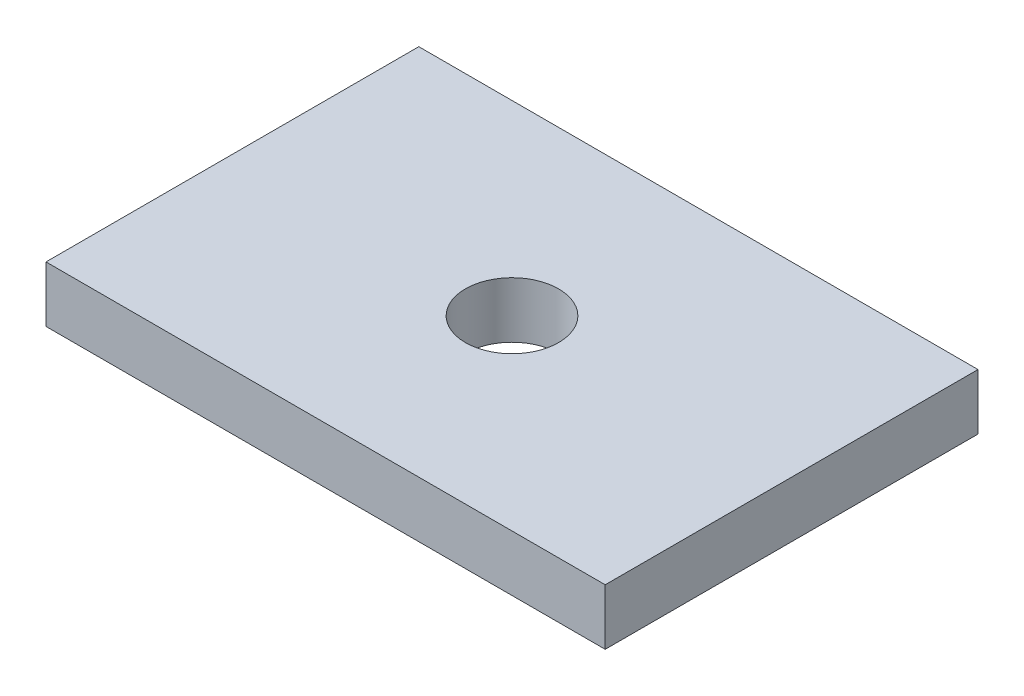
ISO-10303-21;
HEADER;
FILE_DESCRIPTION(('STEP AP214'),'2;1');
FILE_NAME('part.step','',(''),(''),'','','');
FILE_SCHEMA(('AUTOMOTIVE_DESIGN { 1 0 10303 214 1 1 1 1 }'));
ENDSEC;
DATA;
#1=APPLICATION_CONTEXT('core data for automotive mechanical design processes');
#2=APPLICATION_PROTOCOL_DEFINITION('international standard','automotive_design',2000,#1);
#3=PRODUCT_CONTEXT('',#1,'mechanical');
#4=PRODUCT('Part','Part','',(#3));
#5=PRODUCT_RELATED_PRODUCT_CATEGORY('part','',(#4));
#6=PRODUCT_DEFINITION_FORMATION('','',#4);
#7=PRODUCT_DEFINITION_CONTEXT('part definition',#1,'design');
#8=PRODUCT_DEFINITION('design','',#6,#7);
#9=PRODUCT_DEFINITION_SHAPE('','',#8);
#10=(LENGTH_UNIT() NAMED_UNIT(*) SI_UNIT(.MILLI.,.METRE.));
#11=(NAMED_UNIT(*) PLANE_ANGLE_UNIT() SI_UNIT($,.RADIAN.));
#12=(NAMED_UNIT(*) SI_UNIT($,.STERADIAN.) SOLID_ANGLE_UNIT());
#13=UNCERTAINTY_MEASURE_WITH_UNIT(LENGTH_MEASURE(1.E-05),#10,'distance_accuracy_value','');
#14=(GEOMETRIC_REPRESENTATION_CONTEXT(3) GLOBAL_UNCERTAINTY_ASSIGNED_CONTEXT((#13)) GLOBAL_UNIT_ASSIGNED_CONTEXT((#10,
#11,#12)) REPRESENTATION_CONTEXT('',''));
#15=CARTESIAN_POINT('',(0.,0.,0.));
#16=DIRECTION('',(0.,0.,1.));
#17=DIRECTION('',(1.,0.,0.));
#18=AXIS2_PLACEMENT_3D('',#15,#16,#17);
#19=CARTESIAN_POINT('',(30.,6.,-20.));
#20=DIRECTION('',(-1.,0.,0.));
#21=DIRECTION('',(0.,0.,1.));
#22=AXIS2_PLACEMENT_3D('',#19,#20,#21);
#23=PLANE('',#22);
#24=DIRECTION('',(0.,0.,-1.));
#25=VECTOR('',#24,1.);
#26=CARTESIAN_POINT('',(30.,0.,-20.));
#27=LINE('',#26,#25);
#28=CARTESIAN_POINT('',(30.,0.,20.));
#29=VERTEX_POINT('',#28);
#30=CARTESIAN_POINT('',(30.,0.,-20.));
#31=VERTEX_POINT('',#30);
#32=EDGE_CURVE('E97',#29,#31,#27,.T.);
#33=ORIENTED_EDGE('',*,*,#32,.T.);
#34=DIRECTION('',(0.,-1.,0.));
#35=VECTOR('',#34,1.);
#36=CARTESIAN_POINT('',(30.,6.,-20.));
#37=LINE('',#36,#35);
#38=CARTESIAN_POINT('',(30.,6.,-20.));
#39=VERTEX_POINT('',#38);
#40=EDGE_CURVE('E11',#39,#31,#37,.T.);
#41=ORIENTED_EDGE('',*,*,#40,.F.);
#42=DIRECTION('',(0.,0.,-1.));
#43=VECTOR('',#42,1.);
#44=CARTESIAN_POINT('',(30.,6.,-20.));
#45=LINE('',#44,#43);
#46=CARTESIAN_POINT('',(30.,6.,20.));
#47=VERTEX_POINT('',#46);
#48=EDGE_CURVE('E85',#47,#39,#45,.T.);
#49=ORIENTED_EDGE('',*,*,#48,.F.);
#50=DIRECTION('',(0.,-1.,0.));
#51=VECTOR('',#50,1.);
#52=CARTESIAN_POINT('',(30.,6.,20.));
#53=LINE('',#52,#51);
#54=EDGE_CURVE('E93',#47,#29,#53,.T.);
#55=ORIENTED_EDGE('',*,*,#54,.T.);
#56=EDGE_LOOP('',(#33,#41,#49,#55));
#57=FACE_BOUND('',#56,.T.);
#58=ADVANCED_FACE('F34',(#57),#23,.F.);
#59=CARTESIAN_POINT('',(-30.,6.,-20.));
#60=DIRECTION('',(0.,0.,1.));
#61=DIRECTION('',(1.,0.,0.));
#62=AXIS2_PLACEMENT_3D('',#59,#60,#61);
#63=PLANE('',#62);
#64=DIRECTION('',(-1.,0.,0.));
#65=VECTOR('',#64,1.);
#66=CARTESIAN_POINT('',(-30.,0.,-20.));
#67=LINE('',#66,#65);
#68=CARTESIAN_POINT('',(-30.,0.,-20.));
#69=VERTEX_POINT('',#68);
#70=EDGE_CURVE('E89',#31,#69,#67,.T.);
#71=ORIENTED_EDGE('',*,*,#70,.T.);
#72=DIRECTION('',(0.,-1.,0.));
#73=VECTOR('',#72,1.);
#74=CARTESIAN_POINT('',(-30.,6.,-20.));
#75=LINE('',#74,#73);
#76=CARTESIAN_POINT('',(-30.,6.,-20.));
#77=VERTEX_POINT('',#76);
#78=EDGE_CURVE('E42',#77,#69,#75,.T.);
#79=ORIENTED_EDGE('',*,*,#78,.F.);
#80=DIRECTION('',(-1.,0.,0.));
#81=VECTOR('',#80,1.);
#82=CARTESIAN_POINT('',(-30.,6.,-20.));
#83=LINE('',#82,#81);
#84=EDGE_CURVE('E80',#39,#77,#83,.T.);
#85=ORIENTED_EDGE('',*,*,#84,.F.);
#86=ORIENTED_EDGE('',*,*,#40,.T.);
#87=EDGE_LOOP('',(#71,#79,#85,#86));
#88=FACE_BOUND('',#87,.T.);
#89=ADVANCED_FACE('F88',(#88),#63,.F.);
#90=CARTESIAN_POINT('',(-30.,6.,-20.));
#91=DIRECTION('',(1.,0.,0.));
#92=DIRECTION('',(0.,0.,-1.));
#93=AXIS2_PLACEMENT_3D('',#90,#91,#92);
#94=PLANE('',#93);
#95=DIRECTION('',(0.,0.,1.));
#96=VECTOR('',#95,1.);
#97=CARTESIAN_POINT('',(-30.,0.,-20.));
#98=LINE('',#97,#96);
#99=CARTESIAN_POINT('',(-30.,0.,20.));
#100=VERTEX_POINT('',#99);
#101=EDGE_CURVE('E67',#69,#100,#98,.T.);
#102=ORIENTED_EDGE('',*,*,#101,.T.);
#103=DIRECTION('',(0.,-1.,0.));
#104=VECTOR('',#103,1.);
#105=CARTESIAN_POINT('',(-30.,6.,20.));
#106=LINE('',#105,#104);
#107=CARTESIAN_POINT('',(-30.,6.,20.));
#108=VERTEX_POINT('',#107);
#109=EDGE_CURVE('E90',#108,#100,#106,.T.);
#110=ORIENTED_EDGE('',*,*,#109,.F.);
#111=DIRECTION('',(0.,0.,1.));
#112=VECTOR('',#111,1.);
#113=CARTESIAN_POINT('',(-30.,6.,-20.));
#114=LINE('',#113,#112);
#115=EDGE_CURVE('E83',#77,#108,#114,.T.);
#116=ORIENTED_EDGE('',*,*,#115,.F.);
#117=ORIENTED_EDGE('',*,*,#78,.T.);
#118=EDGE_LOOP('',(#102,#110,#116,#117));
#119=FACE_BOUND('',#118,.T.);
#120=ADVANCED_FACE('F91',(#119),#94,.F.);
#121=CARTESIAN_POINT('',(-30.,6.,20.));
#122=DIRECTION('',(0.,0.,-1.));
#123=DIRECTION('',(-1.,0.,0.));
#124=AXIS2_PLACEMENT_3D('',#121,#122,#123);
#125=PLANE('',#124);
#126=DIRECTION('',(1.,0.,0.));
#127=VECTOR('',#126,1.);
#128=CARTESIAN_POINT('',(-30.,0.,20.));
#129=LINE('',#128,#127);
#130=EDGE_CURVE('E73',#100,#29,#129,.T.);
#131=ORIENTED_EDGE('',*,*,#130,.T.);
#132=ORIENTED_EDGE('',*,*,#54,.F.);
#133=DIRECTION('',(1.,0.,0.));
#134=VECTOR('',#133,1.);
#135=CARTESIAN_POINT('',(-30.,6.,20.));
#136=LINE('',#135,#134);
#137=EDGE_CURVE('E50',#108,#47,#136,.T.);
#138=ORIENTED_EDGE('',*,*,#137,.F.);
#139=ORIENTED_EDGE('',*,*,#109,.T.);
#140=EDGE_LOOP('',(#131,#132,#138,#139));
#141=FACE_BOUND('',#140,.T.);
#142=ADVANCED_FACE('F105',(#141),#125,.F.);
#143=CARTESIAN_POINT('',(0.,6.,0.));
#144=DIRECTION('',(0.,1.,0.));
#145=DIRECTION('',(0.,0.,1.));
#146=AXIS2_PLACEMENT_3D('',#143,#144,#145);
#147=PLANE('',#146);
#148=CARTESIAN_POINT('',(0.,6.,0.));
#149=DIRECTION('',(0.,1.,0.));
#150=DIRECTION('',(0.,0.,1.));
#151=AXIS2_PLACEMENT_3D('',#148,#149,#150);
#152=CIRCLE('',#151,5.);
#153=CARTESIAN_POINT('',(0.,6.,5.));
#154=VERTEX_POINT('',#153);
#155=EDGE_CURVE('E111',#154,#154,#152,.T.);
#156=ORIENTED_EDGE('',*,*,#155,.F.);
#157=EDGE_LOOP('',(#156));
#158=FACE_BOUND('',#157,.T.);
#159=ORIENTED_EDGE('',*,*,#48,.T.);
#160=ORIENTED_EDGE('',*,*,#84,.T.);
#161=ORIENTED_EDGE('',*,*,#115,.T.);
#162=ORIENTED_EDGE('',*,*,#137,.T.);
#163=EDGE_LOOP('',(#159,#160,#161,#162));
#164=FACE_BOUND('',#163,.T.);
#165=ADVANCED_FACE('F81',(#158,#164),#147,.T.);
#166=CARTESIAN_POINT('',(0.,0.,0.));
#167=DIRECTION('',(0.,1.,0.));
#168=DIRECTION('',(0.,0.,1.));
#169=AXIS2_PLACEMENT_3D('',#166,#167,#168);
#170=PLANE('',#169);
#171=CARTESIAN_POINT('',(0.,0.,0.));
#172=DIRECTION('',(0.,1.,0.));
#173=DIRECTION('',(0.,0.,1.));
#174=AXIS2_PLACEMENT_3D('',#171,#172,#173);
#175=CIRCLE('',#174,5.);
#176=CARTESIAN_POINT('',(0.,0.,5.));
#177=VERTEX_POINT('',#176);
#178=EDGE_CURVE('E100',#177,#177,#175,.T.);
#179=ORIENTED_EDGE('',*,*,#178,.T.);
#180=EDGE_LOOP('',(#179));
#181=FACE_BOUND('',#180,.T.);
#182=ORIENTED_EDGE('',*,*,#32,.F.);
#183=ORIENTED_EDGE('',*,*,#130,.F.);
#184=ORIENTED_EDGE('',*,*,#101,.F.);
#185=ORIENTED_EDGE('',*,*,#70,.F.);
#186=EDGE_LOOP('',(#182,#183,#184,#185));
#187=FACE_BOUND('',#186,.T.);
#188=ADVANCED_FACE('F108',(#181,#187),#170,.F.);
#189=CARTESIAN_POINT('',(0.,0.,0.));
#190=DIRECTION('',(0.,1.,0.));
#191=DIRECTION('',(0.,0.,1.));
#192=AXIS2_PLACEMENT_3D('',#189,#190,#191);
#193=CYLINDRICAL_SURFACE('',#192,5.);
#194=ORIENTED_EDGE('',*,*,#178,.F.);
#195=EDGE_LOOP('',(#194));
#196=FACE_BOUND('',#195,.T.);
#197=ORIENTED_EDGE('',*,*,#155,.T.);
#198=EDGE_LOOP('',(#197));
#199=FACE_BOUND('',#198,.T.);
#200=ADVANCED_FACE('F118',(#196,#199),#193,.F.);
#201=CLOSED_SHELL('',(#58,#89,#120,#142,#165,#188,#200));
#202=MANIFOLD_SOLID_BREP('B2',#201);
#203=ADVANCED_BREP_SHAPE_REPRESENTATION('',(#18,#202),#14);
#204=SHAPE_DEFINITION_REPRESENTATION(#9,#203);
ENDSEC;
END-ISO-10303-21;
